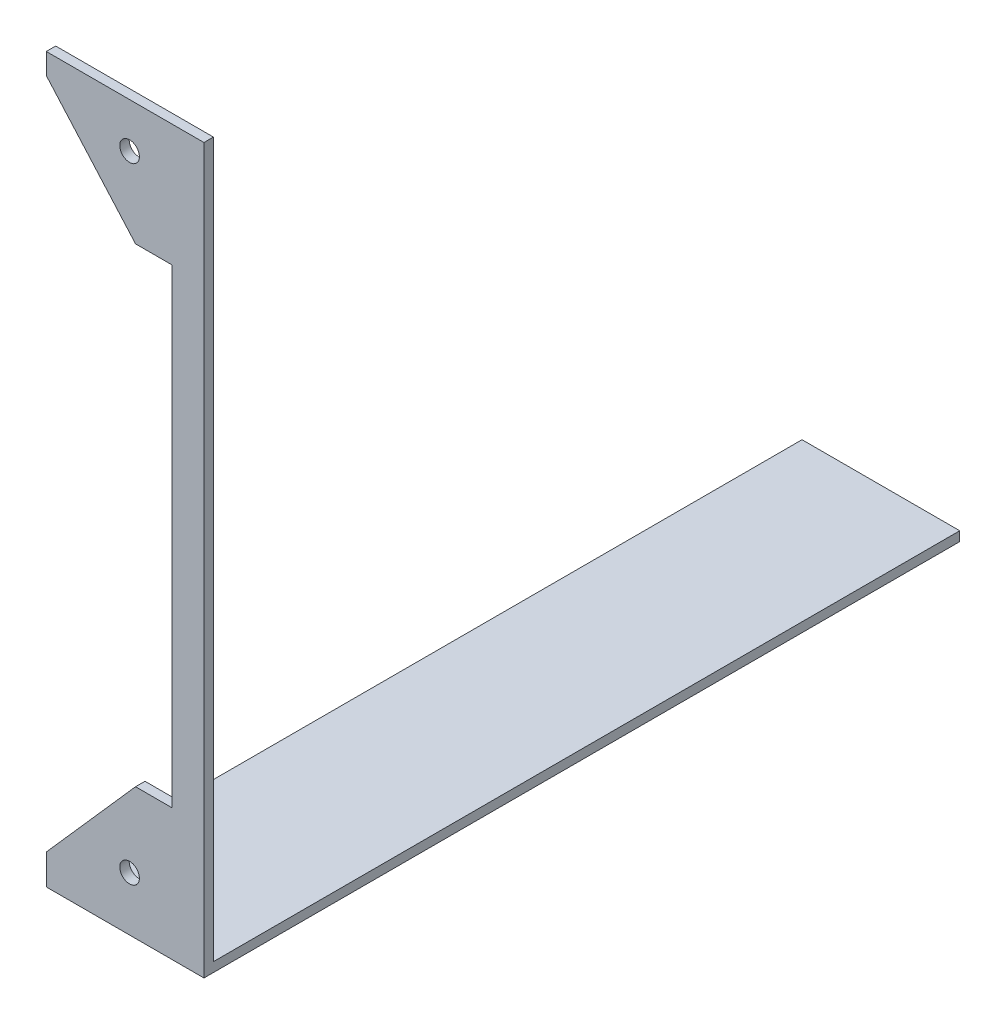
ISO-10303-21;
HEADER;
FILE_DESCRIPTION(('STEP AP214'),'2;1');
FILE_NAME('part.step','',(''),(''),'','','');
FILE_SCHEMA(('AUTOMOTIVE_DESIGN { 1 0 10303 214 1 1 1 1 }'));
ENDSEC;
DATA;
#1=APPLICATION_CONTEXT('core data for automotive mechanical design processes');
#2=APPLICATION_PROTOCOL_DEFINITION('international standard','automotive_design',2000,#1);
#3=PRODUCT_CONTEXT('',#1,'mechanical');
#4=PRODUCT('Part','Part','',(#3));
#5=PRODUCT_RELATED_PRODUCT_CATEGORY('part','',(#4));
#6=PRODUCT_DEFINITION_FORMATION('','',#4);
#7=PRODUCT_DEFINITION_CONTEXT('part definition',#1,'design');
#8=PRODUCT_DEFINITION('design','',#6,#7);
#9=PRODUCT_DEFINITION_SHAPE('','',#8);
#10=(LENGTH_UNIT() NAMED_UNIT(*) SI_UNIT(.MILLI.,.METRE.));
#11=(NAMED_UNIT(*) PLANE_ANGLE_UNIT() SI_UNIT($,.RADIAN.));
#12=(NAMED_UNIT(*) SI_UNIT($,.STERADIAN.) SOLID_ANGLE_UNIT());
#13=UNCERTAINTY_MEASURE_WITH_UNIT(LENGTH_MEASURE(1.E-05),#10,'distance_accuracy_value','');
#14=(GEOMETRIC_REPRESENTATION_CONTEXT(3) GLOBAL_UNCERTAINTY_ASSIGNED_CONTEXT((#13)) GLOBAL_UNIT_ASSIGNED_CONTEXT((#10,
#11,#12)) REPRESENTATION_CONTEXT('',''));
#15=CARTESIAN_POINT('',(0.,0.,0.));
#16=DIRECTION('',(0.,0.,1.));
#17=DIRECTION('',(1.,0.,0.));
#18=AXIS2_PLACEMENT_3D('',#15,#16,#17);
#19=CARTESIAN_POINT('',(0.,0.,1.5875));
#20=DIRECTION('',(0.,0.,-1.));
#21=DIRECTION('',(-1.,0.,0.));
#22=AXIS2_PLACEMENT_3D('',#19,#20,#21);
#23=PLANE('',#22);
#24=DIRECTION('',(0.,1.,0.));
#25=VECTOR('',#24,1.);
#26=CARTESIAN_POINT('',(0.,120.,1.5875));
#27=LINE('',#26,#25);
#28=CARTESIAN_POINT('',(0.,-1.5875,1.5875));
#29=VERTEX_POINT('',#28);
#30=CARTESIAN_POINT('',(0.,120.,1.5875));
#31=VERTEX_POINT('',#30);
#32=EDGE_CURVE('E169',#29,#31,#27,.T.);
#33=ORIENTED_EDGE('',*,*,#32,.T.);
#34=DIRECTION('',(-1.,0.,0.));
#35=VECTOR('',#34,1.);
#36=CARTESIAN_POINT('',(-26.5,120.,1.5875));
#37=LINE('',#36,#35);
#38=CARTESIAN_POINT('',(-26.5,120.,1.5875));
#39=VERTEX_POINT('',#38);
#40=EDGE_CURVE('E103',#31,#39,#37,.T.);
#41=ORIENTED_EDGE('',*,*,#40,.T.);
#42=DIRECTION('',(0.,-1.,0.));
#43=VECTOR('',#42,1.);
#44=CARTESIAN_POINT('',(-26.5,116.5,1.5875));
#45=LINE('',#44,#43);
#46=CARTESIAN_POINT('',(-26.5,116.5,1.5875));
#47=VERTEX_POINT('',#46);
#48=EDGE_CURVE('E184',#39,#47,#45,.T.);
#49=ORIENTED_EDGE('',*,*,#48,.T.);
#50=DIRECTION('',(0.661621637086846,-0.749837855365093,0.));
#51=VECTOR('',#50,1.);
#52=CARTESIAN_POINT('',(-26.5,116.5,1.5875));
#53=LINE('',#52,#51);
#54=CARTESIAN_POINT('',(-11.5,99.5,1.5875));
#55=VERTEX_POINT('',#54);
#56=EDGE_CURVE('E197',#47,#55,#53,.T.);
#57=ORIENTED_EDGE('',*,*,#56,.T.);
#58=DIRECTION('',(1.,0.,0.));
#59=VECTOR('',#58,1.);
#60=CARTESIAN_POINT('',(-11.5,99.5,1.5875));
#61=LINE('',#60,#59);
#62=CARTESIAN_POINT('',(-5.4,99.5,1.5875));
#63=VERTEX_POINT('',#62);
#64=EDGE_CURVE('E126',#55,#63,#61,.T.);
#65=ORIENTED_EDGE('',*,*,#64,.T.);
#66=DIRECTION('',(0.,-1.,0.));
#67=VECTOR('',#66,1.);
#68=CARTESIAN_POINT('',(-5.4,99.5,1.5875));
#69=LINE('',#68,#67);
#70=CARTESIAN_POINT('',(-5.4,20.5,1.5875));
#71=VERTEX_POINT('',#70);
#72=EDGE_CURVE('E119',#63,#71,#69,.T.);
#73=ORIENTED_EDGE('',*,*,#72,.T.);
#74=DIRECTION('',(-1.,0.,0.));
#75=VECTOR('',#74,1.);
#76=CARTESIAN_POINT('',(-5.4,20.5,1.5875));
#77=LINE('',#76,#75);
#78=CARTESIAN_POINT('',(-11.5,20.5,1.5875));
#79=VERTEX_POINT('',#78);
#80=EDGE_CURVE('E123',#71,#79,#77,.T.);
#81=ORIENTED_EDGE('',*,*,#80,.T.);
#82=DIRECTION('',(-0.661621637086846,-0.749837855365093,0.));
#83=VECTOR('',#82,1.);
#84=CARTESIAN_POINT('',(-11.5,20.5,1.5875));
#85=LINE('',#84,#83);
#86=CARTESIAN_POINT('',(-26.5,3.5,1.5875));
#87=VERTEX_POINT('',#86);
#88=EDGE_CURVE('E56',#79,#87,#85,.T.);
#89=ORIENTED_EDGE('',*,*,#88,.T.);
#90=DIRECTION('',(0.,-1.,0.));
#91=VECTOR('',#90,1.);
#92=CARTESIAN_POINT('',(-26.5,3.5,1.5875));
#93=LINE('',#92,#91);
#94=CARTESIAN_POINT('',(-26.5,-1.5875,1.5875));
#95=VERTEX_POINT('',#94);
#96=EDGE_CURVE('E143',#87,#95,#93,.T.);
#97=ORIENTED_EDGE('',*,*,#96,.T.);
#98=DIRECTION('',(1.,0.,0.));
#99=VECTOR('',#98,1.);
#100=CARTESIAN_POINT('',(0.,-1.5875,1.5875));
#101=LINE('',#100,#99);
#102=EDGE_CURVE('E224',#95,#29,#101,.T.);
#103=ORIENTED_EDGE('',*,*,#102,.T.);
#104=EDGE_LOOP('',(#33,#41,#49,#57,#65,#73,#81,#89,#97,#103));
#105=FACE_BOUND('',#104,.T.);
#106=CARTESIAN_POINT('',(-12.5,112.5,1.5875));
#107=DIRECTION('',(0.,0.,1.));
#108=DIRECTION('',(1.,0.,0.));
#109=AXIS2_PLACEMENT_3D('',#106,#107,#108);
#110=CIRCLE('',#109,1.65);
#111=CARTESIAN_POINT('',(-10.85,112.5,1.5875));
#112=VERTEX_POINT('',#111);
#113=EDGE_CURVE('E153',#112,#112,#110,.T.);
#114=ORIENTED_EDGE('',*,*,#113,.F.);
#115=EDGE_LOOP('',(#114));
#116=FACE_BOUND('',#115,.T.);
#117=CARTESIAN_POINT('',(-12.5,7.5,1.5875));
#118=DIRECTION('',(0.,0.,1.));
#119=DIRECTION('',(1.,0.,0.));
#120=AXIS2_PLACEMENT_3D('',#117,#118,#119);
#121=CIRCLE('',#120,1.65);
#122=CARTESIAN_POINT('',(-10.85,7.5,1.5875));
#123=VERTEX_POINT('',#122);
#124=EDGE_CURVE('E206',#123,#123,#121,.T.);
#125=ORIENTED_EDGE('',*,*,#124,.F.);
#126=EDGE_LOOP('',(#125));
#127=FACE_BOUND('',#126,.T.);
#128=ADVANCED_FACE('F39',(#105,#116,#127),#23,.F.);
#129=CARTESIAN_POINT('',(0.,0.,0.));
#130=DIRECTION('',(0.,0.,-1.));
#131=DIRECTION('',(-1.,0.,0.));
#132=AXIS2_PLACEMENT_3D('',#129,#130,#131);
#133=PLANE('',#132);
#134=CARTESIAN_POINT('',(-12.5,112.5,0.));
#135=DIRECTION('',(0.,0.,1.));
#136=DIRECTION('',(1.,0.,0.));
#137=AXIS2_PLACEMENT_3D('',#134,#135,#136);
#138=CIRCLE('',#137,1.65);
#139=CARTESIAN_POINT('',(-10.85,112.5,0.));
#140=VERTEX_POINT('',#139);
#141=EDGE_CURVE('E203',#140,#140,#138,.T.);
#142=ORIENTED_EDGE('',*,*,#141,.T.);
#143=EDGE_LOOP('',(#142));
#144=FACE_BOUND('',#143,.T.);
#145=DIRECTION('',(0.,1.,0.));
#146=VECTOR('',#145,1.);
#147=CARTESIAN_POINT('',(0.,120.,0.));
#148=LINE('',#147,#146);
#149=CARTESIAN_POINT('',(0.,0.,0.));
#150=VERTEX_POINT('',#149);
#151=CARTESIAN_POINT('',(0.,120.,0.));
#152=VERTEX_POINT('',#151);
#153=EDGE_CURVE('E149',#150,#152,#148,.T.);
#154=ORIENTED_EDGE('',*,*,#153,.F.);
#155=DIRECTION('',(1.,0.,0.));
#156=VECTOR('',#155,1.);
#157=CARTESIAN_POINT('',(0.,0.,0.));
#158=LINE('',#157,#156);
#159=CARTESIAN_POINT('',(-26.5,0.,0.));
#160=VERTEX_POINT('',#159);
#161=EDGE_CURVE('E166',#160,#150,#158,.T.);
#162=ORIENTED_EDGE('',*,*,#161,.F.);
#163=DIRECTION('',(0.,-1.,0.));
#164=VECTOR('',#163,1.);
#165=CARTESIAN_POINT('',(-26.5,3.5,0.));
#166=LINE('',#165,#164);
#167=CARTESIAN_POINT('',(-26.5,3.5,0.));
#168=VERTEX_POINT('',#167);
#169=EDGE_CURVE('E95',#168,#160,#166,.T.);
#170=ORIENTED_EDGE('',*,*,#169,.F.);
#171=DIRECTION('',(-0.661621637086846,-0.749837855365093,0.));
#172=VECTOR('',#171,1.);
#173=CARTESIAN_POINT('',(-11.5,20.5,0.));
#174=LINE('',#173,#172);
#175=CARTESIAN_POINT('',(-11.5,20.5,0.));
#176=VERTEX_POINT('',#175);
#177=EDGE_CURVE('E88',#176,#168,#174,.T.);
#178=ORIENTED_EDGE('',*,*,#177,.F.);
#179=DIRECTION('',(-1.,0.,0.));
#180=VECTOR('',#179,1.);
#181=CARTESIAN_POINT('',(-5.4,20.5,0.));
#182=LINE('',#181,#180);
#183=CARTESIAN_POINT('',(-5.4,20.5,0.));
#184=VERTEX_POINT('',#183);
#185=EDGE_CURVE('E162',#184,#176,#182,.T.);
#186=ORIENTED_EDGE('',*,*,#185,.F.);
#187=DIRECTION('',(0.,-1.,0.));
#188=VECTOR('',#187,1.);
#189=CARTESIAN_POINT('',(-5.4,99.5,0.));
#190=LINE('',#189,#188);
#191=CARTESIAN_POINT('',(-5.4,99.5,0.));
#192=VERTEX_POINT('',#191);
#193=EDGE_CURVE('E135',#192,#184,#190,.T.);
#194=ORIENTED_EDGE('',*,*,#193,.F.);
#195=DIRECTION('',(1.,0.,0.));
#196=VECTOR('',#195,1.);
#197=CARTESIAN_POINT('',(-11.5,99.5,0.));
#198=LINE('',#197,#196);
#199=CARTESIAN_POINT('',(-11.5,99.5,0.));
#200=VERTEX_POINT('',#199);
#201=EDGE_CURVE('E159',#200,#192,#198,.T.);
#202=ORIENTED_EDGE('',*,*,#201,.F.);
#203=DIRECTION('',(0.661621637086846,-0.749837855365093,0.));
#204=VECTOR('',#203,1.);
#205=CARTESIAN_POINT('',(-26.5,116.5,0.));
#206=LINE('',#205,#204);
#207=CARTESIAN_POINT('',(-26.5,116.5,0.));
#208=VERTEX_POINT('',#207);
#209=EDGE_CURVE('E157',#208,#200,#206,.T.);
#210=ORIENTED_EDGE('',*,*,#209,.F.);
#211=DIRECTION('',(0.,-1.,0.));
#212=VECTOR('',#211,1.);
#213=CARTESIAN_POINT('',(-26.5,116.5,0.));
#214=LINE('',#213,#212);
#215=CARTESIAN_POINT('',(-26.5,120.,0.));
#216=VERTEX_POINT('',#215);
#217=EDGE_CURVE('E155',#216,#208,#214,.T.);
#218=ORIENTED_EDGE('',*,*,#217,.F.);
#219=DIRECTION('',(-1.,0.,0.));
#220=VECTOR('',#219,1.);
#221=CARTESIAN_POINT('',(-26.5,120.,0.));
#222=LINE('',#221,#220);
#223=EDGE_CURVE('E152',#152,#216,#222,.T.);
#224=ORIENTED_EDGE('',*,*,#223,.F.);
#225=EDGE_LOOP('',(#154,#162,#170,#178,#186,#194,#202,#210,#218,#224));
#226=FACE_BOUND('',#225,.T.);
#227=CARTESIAN_POINT('',(-12.5,7.5,0.));
#228=DIRECTION('',(0.,0.,1.));
#229=DIRECTION('',(1.,0.,0.));
#230=AXIS2_PLACEMENT_3D('',#227,#228,#229);
#231=CIRCLE('',#230,1.65);
#232=CARTESIAN_POINT('',(-10.85,7.5,0.));
#233=VERTEX_POINT('',#232);
#234=EDGE_CURVE('E209',#233,#233,#231,.T.);
#235=ORIENTED_EDGE('',*,*,#234,.T.);
#236=EDGE_LOOP('',(#235));
#237=FACE_BOUND('',#236,.T.);
#238=ADVANCED_FACE('F188',(#144,#226,#237),#133,.T.);
#239=CARTESIAN_POINT('',(0.,120.,1.5875));
#240=DIRECTION('',(-1.,0.,0.));
#241=DIRECTION('',(0.,0.,1.));
#242=AXIS2_PLACEMENT_3D('',#239,#240,#241);
#243=PLANE('',#242);
#244=ORIENTED_EDGE('',*,*,#153,.T.);
#245=DIRECTION('',(0.,0.,-1.));
#246=VECTOR('',#245,1.);
#247=CARTESIAN_POINT('',(0.,120.,1.5875));
#248=LINE('',#247,#246);
#249=EDGE_CURVE('E11',#31,#152,#248,.T.);
#250=ORIENTED_EDGE('',*,*,#249,.F.);
#251=ORIENTED_EDGE('',*,*,#32,.F.);
#252=DIRECTION('',(0.,0.,-1.));
#253=VECTOR('',#252,1.);
#254=CARTESIAN_POINT('',(0.,-1.5875,1.5875));
#255=LINE('',#254,#253);
#256=CARTESIAN_POINT('',(0.,-1.5875,-125.4125));
#257=VERTEX_POINT('',#256);
#258=EDGE_CURVE('E236',#29,#257,#255,.T.);
#259=ORIENTED_EDGE('',*,*,#258,.T.);
#260=DIRECTION('',(0.,1.,0.));
#261=VECTOR('',#260,1.);
#262=CARTESIAN_POINT('',(0.,-1.5875,-125.4125));
#263=LINE('',#262,#261);
#264=CARTESIAN_POINT('',(0.,0.,-125.4125));
#265=VERTEX_POINT('',#264);
#266=EDGE_CURVE('E215',#257,#265,#263,.T.);
#267=ORIENTED_EDGE('',*,*,#266,.T.);
#268=DIRECTION('',(0.,0.,-1.));
#269=VECTOR('',#268,1.);
#270=CARTESIAN_POINT('',(0.,0.,1.5875));
#271=LINE('',#270,#269);
#272=EDGE_CURVE('E228',#150,#265,#271,.T.);
#273=ORIENTED_EDGE('',*,*,#272,.F.);
#274=EDGE_LOOP('',(#244,#250,#251,#259,#267,#273));
#275=FACE_BOUND('',#274,.T.);
#276=ADVANCED_FACE('F41',(#275),#243,.F.);
#277=CARTESIAN_POINT('',(-26.5,120.,1.5875));
#278=DIRECTION('',(0.,-1.,0.));
#279=DIRECTION('',(0.,0.,-1.));
#280=AXIS2_PLACEMENT_3D('',#277,#278,#279);
#281=PLANE('',#280);
#282=ORIENTED_EDGE('',*,*,#223,.T.);
#283=DIRECTION('',(0.,0.,-1.));
#284=VECTOR('',#283,1.);
#285=CARTESIAN_POINT('',(-26.5,120.,1.5875));
#286=LINE('',#285,#284);
#287=EDGE_CURVE('E48',#39,#216,#286,.T.);
#288=ORIENTED_EDGE('',*,*,#287,.F.);
#289=ORIENTED_EDGE('',*,*,#40,.F.);
#290=ORIENTED_EDGE('',*,*,#249,.T.);
#291=EDGE_LOOP('',(#282,#288,#289,#290));
#292=FACE_BOUND('',#291,.T.);
#293=ADVANCED_FACE('F267',(#292),#281,.F.);
#294=CARTESIAN_POINT('',(-26.5,116.5,1.5875));
#295=DIRECTION('',(1.,0.,0.));
#296=DIRECTION('',(0.,1.,0.));
#297=AXIS2_PLACEMENT_3D('',#294,#295,#296);
#298=PLANE('',#297);
#299=ORIENTED_EDGE('',*,*,#217,.T.);
#300=DIRECTION('',(0.,0.,-1.));
#301=VECTOR('',#300,1.);
#302=CARTESIAN_POINT('',(-26.5,116.5,1.5875));
#303=LINE('',#302,#301);
#304=EDGE_CURVE('E176',#47,#208,#303,.T.);
#305=ORIENTED_EDGE('',*,*,#304,.F.);
#306=ORIENTED_EDGE('',*,*,#48,.F.);
#307=ORIENTED_EDGE('',*,*,#287,.T.);
#308=EDGE_LOOP('',(#299,#305,#306,#307));
#309=FACE_BOUND('',#308,.T.);
#310=ADVANCED_FACE('F182',(#309),#298,.F.);
#311=CARTESIAN_POINT('',(-26.5,116.5,1.5875));
#312=DIRECTION('',(0.749837855365093,0.661621637086846,0.));
#313=DIRECTION('',(-0.661621637086846,0.749837855365093,0.));
#314=AXIS2_PLACEMENT_3D('',#311,#312,#313);
#315=PLANE('',#314);
#316=ORIENTED_EDGE('',*,*,#209,.T.);
#317=DIRECTION('',(0.,0.,-1.));
#318=VECTOR('',#317,1.);
#319=CARTESIAN_POINT('',(-11.5,99.5,1.5875));
#320=LINE('',#319,#318);
#321=EDGE_CURVE('E173',#55,#200,#320,.T.);
#322=ORIENTED_EDGE('',*,*,#321,.F.);
#323=ORIENTED_EDGE('',*,*,#56,.F.);
#324=ORIENTED_EDGE('',*,*,#304,.T.);
#325=EDGE_LOOP('',(#316,#322,#323,#324));
#326=FACE_BOUND('',#325,.T.);
#327=ADVANCED_FACE('F193',(#326),#315,.F.);
#328=CARTESIAN_POINT('',(-11.5,99.5,1.5875));
#329=DIRECTION('',(0.,1.,0.));
#330=DIRECTION('',(0.,0.,1.));
#331=AXIS2_PLACEMENT_3D('',#328,#329,#330);
#332=PLANE('',#331);
#333=ORIENTED_EDGE('',*,*,#201,.T.);
#334=DIRECTION('',(0.,0.,-1.));
#335=VECTOR('',#334,1.);
#336=CARTESIAN_POINT('',(-5.4,99.5,1.5875));
#337=LINE('',#336,#335);
#338=EDGE_CURVE('E138',#63,#192,#337,.T.);
#339=ORIENTED_EDGE('',*,*,#338,.F.);
#340=ORIENTED_EDGE('',*,*,#64,.F.);
#341=ORIENTED_EDGE('',*,*,#321,.T.);
#342=EDGE_LOOP('',(#333,#339,#340,#341));
#343=FACE_BOUND('',#342,.T.);
#344=ADVANCED_FACE('F196',(#343),#332,.F.);
#345=CARTESIAN_POINT('',(-5.4,99.5,1.5875));
#346=DIRECTION('',(1.,0.,0.));
#347=DIRECTION('',(0.,0.,-1.));
#348=AXIS2_PLACEMENT_3D('',#345,#346,#347);
#349=PLANE('',#348);
#350=ORIENTED_EDGE('',*,*,#193,.T.);
#351=DIRECTION('',(0.,0.,-1.));
#352=VECTOR('',#351,1.);
#353=CARTESIAN_POINT('',(-5.4,20.5,1.5875));
#354=LINE('',#353,#352);
#355=EDGE_CURVE('E132',#71,#184,#354,.T.);
#356=ORIENTED_EDGE('',*,*,#355,.F.);
#357=ORIENTED_EDGE('',*,*,#72,.F.);
#358=ORIENTED_EDGE('',*,*,#338,.T.);
#359=EDGE_LOOP('',(#350,#356,#357,#358));
#360=FACE_BOUND('',#359,.T.);
#361=ADVANCED_FACE('F133',(#360),#349,.F.);
#362=CARTESIAN_POINT('',(-5.4,20.5,1.5875));
#363=DIRECTION('',(0.,-1.,0.));
#364=DIRECTION('',(0.,0.,-1.));
#365=AXIS2_PLACEMENT_3D('',#362,#363,#364);
#366=PLANE('',#365);
#367=ORIENTED_EDGE('',*,*,#185,.T.);
#368=DIRECTION('',(0.,0.,-1.));
#369=VECTOR('',#368,1.);
#370=CARTESIAN_POINT('',(-11.5,20.5,1.5875));
#371=LINE('',#370,#369);
#372=EDGE_CURVE('E139',#79,#176,#371,.T.);
#373=ORIENTED_EDGE('',*,*,#372,.F.);
#374=ORIENTED_EDGE('',*,*,#80,.F.);
#375=ORIENTED_EDGE('',*,*,#355,.T.);
#376=EDGE_LOOP('',(#367,#373,#374,#375));
#377=FACE_BOUND('',#376,.T.);
#378=ADVANCED_FACE('F141',(#377),#366,.F.);
#379=CARTESIAN_POINT('',(-11.5,20.5,1.5875));
#380=DIRECTION('',(0.749837855365093,-0.661621637086846,0.));
#381=DIRECTION('',(0.661621637086846,0.749837855365093,0.));
#382=AXIS2_PLACEMENT_3D('',#379,#380,#381);
#383=PLANE('',#382);
#384=ORIENTED_EDGE('',*,*,#177,.T.);
#385=DIRECTION('',(0.,0.,-1.));
#386=VECTOR('',#385,1.);
#387=CARTESIAN_POINT('',(-26.5,3.5,1.5875));
#388=LINE('',#387,#386);
#389=EDGE_CURVE('E148',#87,#168,#388,.T.);
#390=ORIENTED_EDGE('',*,*,#389,.F.);
#391=ORIENTED_EDGE('',*,*,#88,.F.);
#392=ORIENTED_EDGE('',*,*,#372,.T.);
#393=EDGE_LOOP('',(#384,#390,#391,#392));
#394=FACE_BOUND('',#393,.T.);
#395=ADVANCED_FACE('F288',(#394),#383,.F.);
#396=CARTESIAN_POINT('',(-26.5,3.5,1.5875));
#397=DIRECTION('',(1.,0.,0.));
#398=DIRECTION('',(0.,0.,-1.));
#399=AXIS2_PLACEMENT_3D('',#396,#397,#398);
#400=PLANE('',#399);
#401=ORIENTED_EDGE('',*,*,#169,.T.);
#402=DIRECTION('',(0.,0.,1.));
#403=VECTOR('',#402,1.);
#404=CARTESIAN_POINT('',(-26.5,0.,-125.4125));
#405=LINE('',#404,#403);
#406=CARTESIAN_POINT('',(-26.5,0.,-125.4125));
#407=VERTEX_POINT('',#406);
#408=EDGE_CURVE('E221',#407,#160,#405,.T.);
#409=ORIENTED_EDGE('',*,*,#408,.F.);
#410=DIRECTION('',(0.,1.,0.));
#411=VECTOR('',#410,1.);
#412=CARTESIAN_POINT('',(-26.5,-1.5875,-125.4125));
#413=LINE('',#412,#411);
#414=CARTESIAN_POINT('',(-26.5,-1.5875,-125.4125));
#415=VERTEX_POINT('',#414);
#416=EDGE_CURVE('E212',#415,#407,#413,.T.);
#417=ORIENTED_EDGE('',*,*,#416,.F.);
#418=DIRECTION('',(0.,0.,1.));
#419=VECTOR('',#418,1.);
#420=CARTESIAN_POINT('',(-26.5,-1.5875,-125.4125));
#421=LINE('',#420,#419);
#422=EDGE_CURVE('E218',#415,#95,#421,.T.);
#423=ORIENTED_EDGE('',*,*,#422,.T.);
#424=ORIENTED_EDGE('',*,*,#96,.F.);
#425=ORIENTED_EDGE('',*,*,#389,.T.);
#426=EDGE_LOOP('',(#401,#409,#417,#423,#424,#425));
#427=FACE_BOUND('',#426,.T.);
#428=ADVANCED_FACE('F257',(#427),#400,.F.);
#429=CARTESIAN_POINT('',(-12.5,112.5,1.5875));
#430=DIRECTION('',(0.,0.,-1.));
#431=DIRECTION('',(-1.,0.,0.));
#432=AXIS2_PLACEMENT_3D('',#429,#430,#431);
#433=CYLINDRICAL_SURFACE('',#432,1.65);
#434=ORIENTED_EDGE('',*,*,#141,.F.);
#435=EDGE_LOOP('',(#434));
#436=FACE_BOUND('',#435,.T.);
#437=ORIENTED_EDGE('',*,*,#113,.T.);
#438=EDGE_LOOP('',(#437));
#439=FACE_BOUND('',#438,.T.);
#440=ADVANCED_FACE('F283',(#436,#439),#433,.F.);
#441=CARTESIAN_POINT('',(-12.5,7.5,1.5875));
#442=DIRECTION('',(0.,0.,-1.));
#443=DIRECTION('',(-1.,0.,0.));
#444=AXIS2_PLACEMENT_3D('',#441,#442,#443);
#445=CYLINDRICAL_SURFACE('',#444,1.65);
#446=ORIENTED_EDGE('',*,*,#234,.F.);
#447=EDGE_LOOP('',(#446));
#448=FACE_BOUND('',#447,.T.);
#449=ORIENTED_EDGE('',*,*,#124,.T.);
#450=EDGE_LOOP('',(#449));
#451=FACE_BOUND('',#450,.T.);
#452=ADVANCED_FACE('F329',(#448,#451),#445,.F.);
#453=CARTESIAN_POINT('',(0.,-1.5875,-125.4125));
#454=DIRECTION('',(0.,0.,-1.));
#455=DIRECTION('',(-1.,0.,0.));
#456=AXIS2_PLACEMENT_3D('',#453,#454,#455);
#457=PLANE('',#456);
#458=DIRECTION('',(-1.,0.,0.));
#459=VECTOR('',#458,1.);
#460=CARTESIAN_POINT('',(0.,0.,-125.4125));
#461=LINE('',#460,#459);
#462=EDGE_CURVE('E225',#265,#407,#461,.T.);
#463=ORIENTED_EDGE('',*,*,#462,.F.);
#464=ORIENTED_EDGE('',*,*,#266,.F.);
#465=DIRECTION('',(-1.,0.,0.));
#466=VECTOR('',#465,1.);
#467=CARTESIAN_POINT('',(0.,-1.5875,-125.4125));
#468=LINE('',#467,#466);
#469=EDGE_CURVE('E233',#257,#415,#468,.T.);
#470=ORIENTED_EDGE('',*,*,#469,.T.);
#471=ORIENTED_EDGE('',*,*,#416,.T.);
#472=EDGE_LOOP('',(#463,#464,#470,#471));
#473=FACE_BOUND('',#472,.T.);
#474=ADVANCED_FACE('F262',(#473),#457,.T.);
#475=CARTESIAN_POINT('',(0.,-1.5875,0.));
#476=DIRECTION('',(0.,1.,0.));
#477=DIRECTION('',(0.,0.,1.));
#478=AXIS2_PLACEMENT_3D('',#475,#476,#477);
#479=PLANE('',#478);
#480=ORIENTED_EDGE('',*,*,#102,.F.);
#481=ORIENTED_EDGE('',*,*,#422,.F.);
#482=ORIENTED_EDGE('',*,*,#469,.F.);
#483=ORIENTED_EDGE('',*,*,#258,.F.);
#484=EDGE_LOOP('',(#480,#481,#482,#483));
#485=FACE_BOUND('',#484,.T.);
#486=ADVANCED_FACE('F252',(#485),#479,.F.);
#487=CARTESIAN_POINT('',(0.,0.,0.));
#488=DIRECTION('',(0.,1.,0.));
#489=DIRECTION('',(0.,0.,1.));
#490=AXIS2_PLACEMENT_3D('',#487,#488,#489);
#491=PLANE('',#490);
#492=ORIENTED_EDGE('',*,*,#408,.T.);
#493=ORIENTED_EDGE('',*,*,#161,.T.);
#494=ORIENTED_EDGE('',*,*,#272,.T.);
#495=ORIENTED_EDGE('',*,*,#462,.T.);
#496=EDGE_LOOP('',(#492,#493,#494,#495));
#497=FACE_BOUND('',#496,.T.);
#498=ADVANCED_FACE('F379',(#497),#491,.T.);
#499=CLOSED_SHELL('',(#128,#238,#276,#293,#310,#327,#344,#361,#378,#395,#428,#440,#452,#474,
#486,#498));
#500=MANIFOLD_SOLID_BREP('B2',#499);
#501=ADVANCED_BREP_SHAPE_REPRESENTATION('',(#18,#500),#14);
#502=SHAPE_DEFINITION_REPRESENTATION(#9,#501);
ENDSEC;
END-ISO-10303-21;
